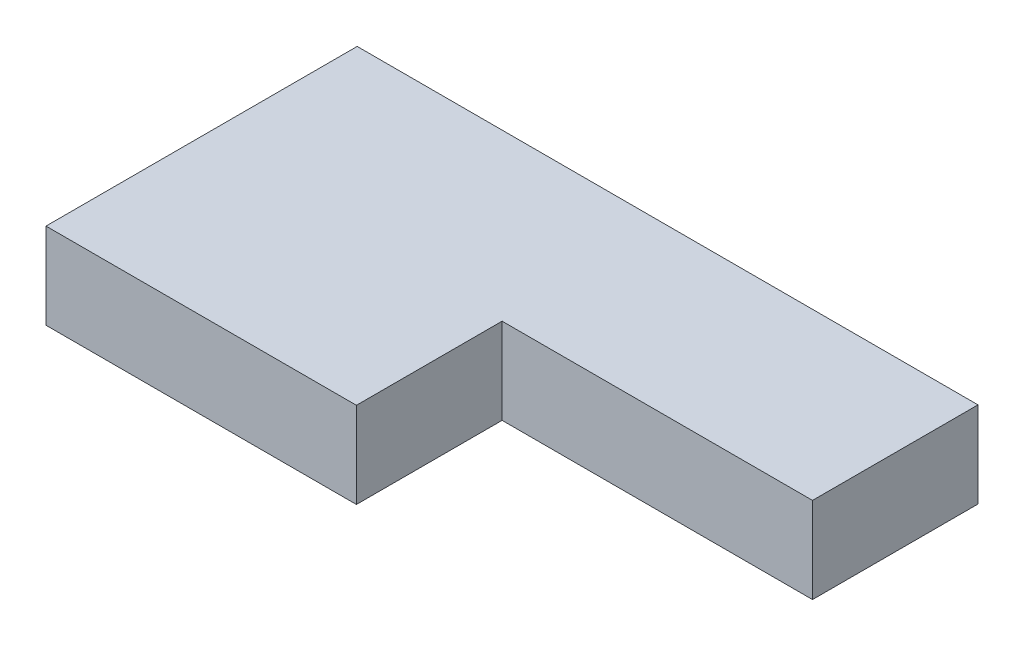
ISO-10303-21;
HEADER;
FILE_DESCRIPTION(('STEP AP214'),'2;1');
FILE_NAME('part.step','',(''),(''),'','','');
FILE_SCHEMA(('AUTOMOTIVE_DESIGN { 1 0 10303 214 1 1 1 1 }'));
ENDSEC;
DATA;
#1=APPLICATION_CONTEXT('core data for automotive mechanical design processes');
#2=APPLICATION_PROTOCOL_DEFINITION('international standard','automotive_design',2000,#1);
#3=PRODUCT_CONTEXT('',#1,'mechanical');
#4=PRODUCT('Part','Part','',(#3));
#5=PRODUCT_RELATED_PRODUCT_CATEGORY('part','',(#4));
#6=PRODUCT_DEFINITION_FORMATION('','',#4);
#7=PRODUCT_DEFINITION_CONTEXT('part definition',#1,'design');
#8=PRODUCT_DEFINITION('design','',#6,#7);
#9=PRODUCT_DEFINITION_SHAPE('','',#8);
#10=(LENGTH_UNIT() NAMED_UNIT(*) SI_UNIT(.MILLI.,.METRE.));
#11=(NAMED_UNIT(*) PLANE_ANGLE_UNIT() SI_UNIT($,.RADIAN.));
#12=(NAMED_UNIT(*) SI_UNIT($,.STERADIAN.) SOLID_ANGLE_UNIT());
#13=UNCERTAINTY_MEASURE_WITH_UNIT(LENGTH_MEASURE(1.E-05),#10,'distance_accuracy_value','');
#14=(GEOMETRIC_REPRESENTATION_CONTEXT(3) GLOBAL_UNCERTAINTY_ASSIGNED_CONTEXT((#13)) GLOBAL_UNIT_ASSIGNED_CONTEXT((#10,
#11,#12)) REPRESENTATION_CONTEXT('',''));
#15=CARTESIAN_POINT('',(0.,0.,0.));
#16=DIRECTION('',(0.,0.,1.));
#17=DIRECTION('',(1.,0.,0.));
#18=AXIS2_PLACEMENT_3D('',#15,#16,#17);
#19=CARTESIAN_POINT('',(0.,-12.7,5.31773399014777));
#20=DIRECTION('',(-1.,0.,0.));
#21=DIRECTION('',(0.,0.,1.));
#22=AXIS2_PLACEMENT_3D('',#19,#20,#21);
#23=PLANE('',#22);
#24=DIRECTION('',(0.,0.,1.));
#25=VECTOR('',#24,1.);
#26=CARTESIAN_POINT('',(0.,0.,5.31773399014777));
#27=LINE('',#26,#25);
#28=CARTESIAN_POINT('',(0.,0.,-40.6806650246305));
#29=VERTEX_POINT('',#28);
#30=CARTESIAN_POINT('',(0.,0.,5.31773399014777));
#31=VERTEX_POINT('',#30);
#32=EDGE_CURVE('E116',#29,#31,#27,.T.);
#33=ORIENTED_EDGE('',*,*,#32,.F.);
#34=DIRECTION('',(0.,1.,0.));
#35=VECTOR('',#34,1.);
#36=CARTESIAN_POINT('',(0.,-12.7,-40.6806650246305));
#37=LINE('',#36,#35);
#38=CARTESIAN_POINT('',(0.,-12.7,-40.6806650246305));
#39=VERTEX_POINT('',#38);
#40=EDGE_CURVE('E11',#39,#29,#37,.T.);
#41=ORIENTED_EDGE('',*,*,#40,.F.);
#42=DIRECTION('',(0.,0.,1.));
#43=VECTOR('',#42,1.);
#44=CARTESIAN_POINT('',(0.,-12.7,5.31773399014777));
#45=LINE('',#44,#43);
#46=CARTESIAN_POINT('',(0.,-12.7,5.31773399014777));
#47=VERTEX_POINT('',#46);
#48=EDGE_CURVE('E130',#39,#47,#45,.T.);
#49=ORIENTED_EDGE('',*,*,#48,.T.);
#50=DIRECTION('',(0.,1.,0.));
#51=VECTOR('',#50,1.);
#52=CARTESIAN_POINT('',(0.,-12.7,5.31773399014777));
#53=LINE('',#52,#51);
#54=EDGE_CURVE('E34',#47,#31,#53,.T.);
#55=ORIENTED_EDGE('',*,*,#54,.T.);
#56=EDGE_LOOP('',(#33,#41,#49,#55));
#57=FACE_BOUND('',#56,.T.);
#58=ADVANCED_FACE('F31',(#57),#23,.T.);
#59=CARTESIAN_POINT('',(0.,-12.7,-40.6806650246305));
#60=DIRECTION('',(0.,0.,-1.));
#61=DIRECTION('',(-1.,0.,0.));
#62=AXIS2_PLACEMENT_3D('',#59,#60,#61);
#63=PLANE('',#62);
#64=DIRECTION('',(-1.,0.,0.));
#65=VECTOR('',#64,1.);
#66=CARTESIAN_POINT('',(0.,0.,-40.6806650246305));
#67=LINE('',#66,#65);
#68=CARTESIAN_POINT('',(91.7709437095257,0.,-40.6806650246305));
#69=VERTEX_POINT('',#68);
#70=EDGE_CURVE('E128',#69,#29,#67,.T.);
#71=ORIENTED_EDGE('',*,*,#70,.F.);
#72=DIRECTION('',(0.,1.,0.));
#73=VECTOR('',#72,1.);
#74=CARTESIAN_POINT('',(91.7709437095257,-12.7,-40.6806650246305));
#75=LINE('',#74,#73);
#76=CARTESIAN_POINT('',(91.7709437095257,-12.7,-40.6806650246305));
#77=VERTEX_POINT('',#76);
#78=EDGE_CURVE('E40',#77,#69,#75,.T.);
#79=ORIENTED_EDGE('',*,*,#78,.F.);
#80=DIRECTION('',(-1.,0.,0.));
#81=VECTOR('',#80,1.);
#82=CARTESIAN_POINT('',(0.,-12.7,-40.6806650246305));
#83=LINE('',#82,#81);
#84=EDGE_CURVE('E106',#77,#39,#83,.T.);
#85=ORIENTED_EDGE('',*,*,#84,.T.);
#86=ORIENTED_EDGE('',*,*,#40,.T.);
#87=EDGE_LOOP('',(#71,#79,#85,#86));
#88=FACE_BOUND('',#87,.T.);
#89=ADVANCED_FACE('F138',(#88),#63,.T.);
#90=CARTESIAN_POINT('',(91.7709437095257,-12.7,-40.6806650246305));
#91=DIRECTION('',(1.,0.,0.));
#92=DIRECTION('',(0.,0.,-1.));
#93=AXIS2_PLACEMENT_3D('',#90,#91,#92);
#94=PLANE('',#93);
#95=DIRECTION('',(0.,0.,-1.));
#96=VECTOR('',#95,1.);
#97=CARTESIAN_POINT('',(91.7709437095257,0.,-40.6806650246305));
#98=LINE('',#97,#96);
#99=CARTESIAN_POINT('',(91.7709437095257,0.,-16.2190886699507));
#100=VERTEX_POINT('',#99);
#101=EDGE_CURVE('E93',#100,#69,#98,.T.);
#102=ORIENTED_EDGE('',*,*,#101,.F.);
#103=DIRECTION('',(0.,1.,0.));
#104=VECTOR('',#103,1.);
#105=CARTESIAN_POINT('',(91.7709437095257,-12.7,-16.2190886699507));
#106=LINE('',#105,#104);
#107=CARTESIAN_POINT('',(91.7709437095257,-12.7,-16.2190886699507));
#108=VERTEX_POINT('',#107);
#109=EDGE_CURVE('E88',#108,#100,#106,.T.);
#110=ORIENTED_EDGE('',*,*,#109,.F.);
#111=DIRECTION('',(0.,0.,-1.));
#112=VECTOR('',#111,1.);
#113=CARTESIAN_POINT('',(91.7709437095257,-12.7,-40.6806650246305));
#114=LINE('',#113,#112);
#115=EDGE_CURVE('E91',#108,#77,#114,.T.);
#116=ORIENTED_EDGE('',*,*,#115,.T.);
#117=ORIENTED_EDGE('',*,*,#78,.T.);
#118=EDGE_LOOP('',(#102,#110,#116,#117));
#119=FACE_BOUND('',#118,.T.);
#120=ADVANCED_FACE('F90',(#119),#94,.T.);
#121=CARTESIAN_POINT('',(91.7709437095257,-12.7,-16.2190886699507));
#122=DIRECTION('',(0.,0.,1.));
#123=DIRECTION('',(1.,0.,0.));
#124=AXIS2_PLACEMENT_3D('',#121,#122,#123);
#125=PLANE('',#124);
#126=DIRECTION('',(1.,0.,0.));
#127=VECTOR('',#126,1.);
#128=CARTESIAN_POINT('',(91.7709437095257,0.,-16.2190886699507));
#129=LINE('',#128,#127);
#130=CARTESIAN_POINT('',(45.8854718547628,0.,-16.2190886699507));
#131=VERTEX_POINT('',#130);
#132=EDGE_CURVE('E125',#131,#100,#129,.T.);
#133=ORIENTED_EDGE('',*,*,#132,.F.);
#134=DIRECTION('',(0.,1.,0.));
#135=VECTOR('',#134,1.);
#136=CARTESIAN_POINT('',(45.8854718547628,-12.7,-16.2190886699507));
#137=LINE('',#136,#135);
#138=CARTESIAN_POINT('',(45.8854718547628,-12.7,-16.2190886699507));
#139=VERTEX_POINT('',#138);
#140=EDGE_CURVE('E98',#139,#131,#137,.T.);
#141=ORIENTED_EDGE('',*,*,#140,.F.);
#142=DIRECTION('',(1.,0.,0.));
#143=VECTOR('',#142,1.);
#144=CARTESIAN_POINT('',(91.7709437095257,-12.7,-16.2190886699507));
#145=LINE('',#144,#143);
#146=EDGE_CURVE('E104',#139,#108,#145,.T.);
#147=ORIENTED_EDGE('',*,*,#146,.T.);
#148=ORIENTED_EDGE('',*,*,#109,.T.);
#149=EDGE_LOOP('',(#133,#141,#147,#148));
#150=FACE_BOUND('',#149,.T.);
#151=ADVANCED_FACE('F108',(#150),#125,.T.);
#152=CARTESIAN_POINT('',(45.8854718547628,-12.7,-16.2190886699507));
#153=DIRECTION('',(1.,0.,0.));
#154=DIRECTION('',(0.,0.,-1.));
#155=AXIS2_PLACEMENT_3D('',#152,#153,#154);
#156=PLANE('',#155);
#157=DIRECTION('',(0.,0.,-1.));
#158=VECTOR('',#157,1.);
#159=CARTESIAN_POINT('',(45.8854718547628,0.,-16.2190886699507));
#160=LINE('',#159,#158);
#161=CARTESIAN_POINT('',(45.8854718547628,0.,5.31773399014777));
#162=VERTEX_POINT('',#161);
#163=EDGE_CURVE('E122',#162,#131,#160,.T.);
#164=ORIENTED_EDGE('',*,*,#163,.F.);
#165=DIRECTION('',(0.,1.,0.));
#166=VECTOR('',#165,1.);
#167=CARTESIAN_POINT('',(45.8854718547628,-12.7,5.31773399014777));
#168=LINE('',#167,#166);
#169=CARTESIAN_POINT('',(45.8854718547628,-12.7,5.31773399014777));
#170=VERTEX_POINT('',#169);
#171=EDGE_CURVE('E133',#170,#162,#168,.T.);
#172=ORIENTED_EDGE('',*,*,#171,.F.);
#173=DIRECTION('',(0.,0.,-1.));
#174=VECTOR('',#173,1.);
#175=CARTESIAN_POINT('',(45.8854718547628,-12.7,-16.2190886699507));
#176=LINE('',#175,#174);
#177=EDGE_CURVE('E109',#170,#139,#176,.T.);
#178=ORIENTED_EDGE('',*,*,#177,.T.);
#179=ORIENTED_EDGE('',*,*,#140,.T.);
#180=EDGE_LOOP('',(#164,#172,#178,#179));
#181=FACE_BOUND('',#180,.T.);
#182=ADVANCED_FACE('F151',(#181),#156,.T.);
#183=CARTESIAN_POINT('',(45.8854718547628,-12.7,5.31773399014777));
#184=DIRECTION('',(0.,0.,1.));
#185=DIRECTION('',(1.,0.,0.));
#186=AXIS2_PLACEMENT_3D('',#183,#184,#185);
#187=PLANE('',#186);
#188=DIRECTION('',(1.,0.,0.));
#189=VECTOR('',#188,1.);
#190=CARTESIAN_POINT('',(45.8854718547628,0.,5.31773399014777));
#191=LINE('',#190,#189);
#192=EDGE_CURVE('E119',#31,#162,#191,.T.);
#193=ORIENTED_EDGE('',*,*,#192,.F.);
#194=ORIENTED_EDGE('',*,*,#54,.F.);
#195=DIRECTION('',(1.,0.,0.));
#196=VECTOR('',#195,1.);
#197=CARTESIAN_POINT('',(45.8854718547628,-12.7,5.31773399014777));
#198=LINE('',#197,#196);
#199=EDGE_CURVE('E111',#47,#170,#198,.T.);
#200=ORIENTED_EDGE('',*,*,#199,.T.);
#201=ORIENTED_EDGE('',*,*,#171,.T.);
#202=EDGE_LOOP('',(#193,#194,#200,#201));
#203=FACE_BOUND('',#202,.T.);
#204=ADVANCED_FACE('F135',(#203),#187,.T.);
#205=CARTESIAN_POINT('',(0.,-12.7,-40.6806650246305));
#206=DIRECTION('',(0.,-1.,0.));
#207=DIRECTION('',(0.,0.,-1.));
#208=AXIS2_PLACEMENT_3D('',#205,#206,#207);
#209=PLANE('',#208);
#210=ORIENTED_EDGE('',*,*,#48,.F.);
#211=ORIENTED_EDGE('',*,*,#84,.F.);
#212=ORIENTED_EDGE('',*,*,#115,.F.);
#213=ORIENTED_EDGE('',*,*,#146,.F.);
#214=ORIENTED_EDGE('',*,*,#177,.F.);
#215=ORIENTED_EDGE('',*,*,#199,.F.);
#216=EDGE_LOOP('',(#210,#211,#212,#213,#214,#215));
#217=FACE_BOUND('',#216,.T.);
#218=ADVANCED_FACE('F102',(#217),#209,.T.);
#219=CARTESIAN_POINT('',(0.,0.,-40.6806650246305));
#220=DIRECTION('',(0.,-1.,0.));
#221=DIRECTION('',(0.,0.,-1.));
#222=AXIS2_PLACEMENT_3D('',#219,#220,#221);
#223=PLANE('',#222);
#224=ORIENTED_EDGE('',*,*,#32,.T.);
#225=ORIENTED_EDGE('',*,*,#192,.T.);
#226=ORIENTED_EDGE('',*,*,#163,.T.);
#227=ORIENTED_EDGE('',*,*,#132,.T.);
#228=ORIENTED_EDGE('',*,*,#101,.T.);
#229=ORIENTED_EDGE('',*,*,#70,.T.);
#230=EDGE_LOOP('',(#224,#225,#226,#227,#228,#229));
#231=FACE_BOUND('',#230,.T.);
#232=ADVANCED_FACE('F137',(#231),#223,.F.);
#233=CLOSED_SHELL('',(#58,#89,#120,#151,#182,#204,#218,#232));
#234=MANIFOLD_SOLID_BREP('B2',#233);
#235=ADVANCED_BREP_SHAPE_REPRESENTATION('',(#18,#234),#14);
#236=SHAPE_DEFINITION_REPRESENTATION(#9,#235);
ENDSEC;
END-ISO-10303-21;
